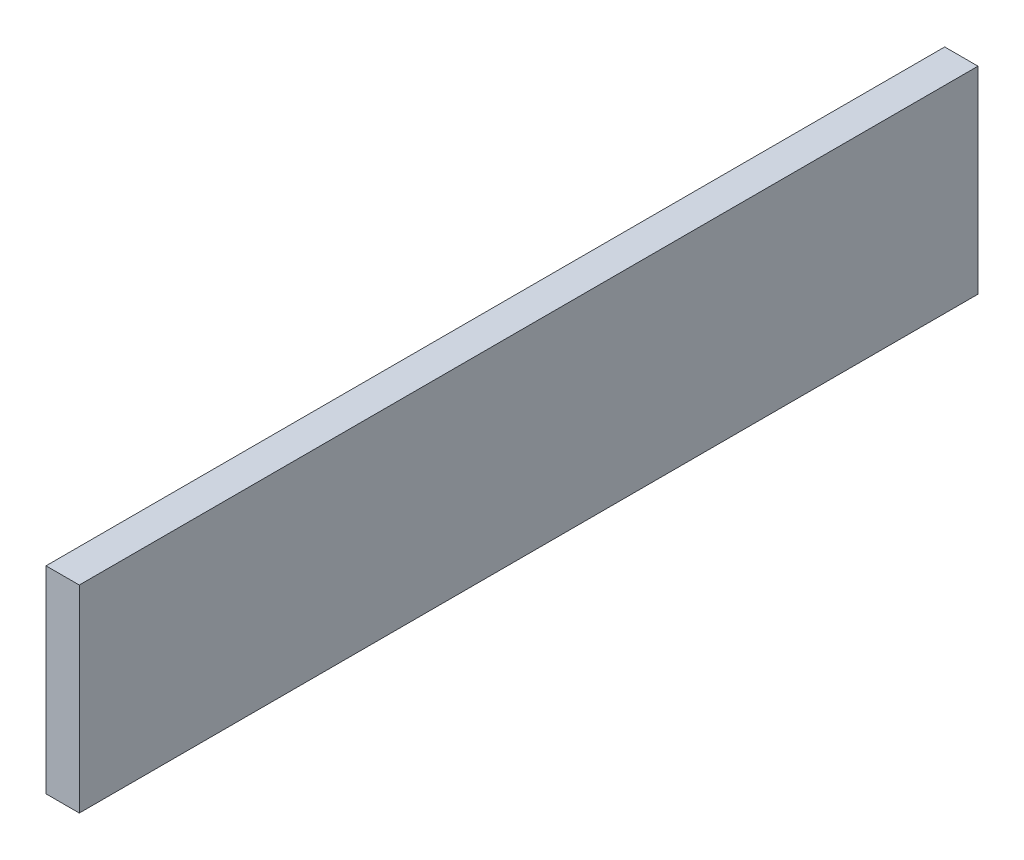
ISO-10303-21;
HEADER;
FILE_DESCRIPTION(('STEP AP214'),'2;1');
FILE_NAME('part.step','',(''),(''),'','','');
FILE_SCHEMA(('AUTOMOTIVE_DESIGN { 1 0 10303 214 1 1 1 1 }'));
ENDSEC;
DATA;
#1=APPLICATION_CONTEXT('core data for automotive mechanical design processes');
#2=APPLICATION_PROTOCOL_DEFINITION('international standard','automotive_design',2000,#1);
#3=PRODUCT_CONTEXT('',#1,'mechanical');
#4=PRODUCT('Part','Part','',(#3));
#5=PRODUCT_RELATED_PRODUCT_CATEGORY('part','',(#4));
#6=PRODUCT_DEFINITION_FORMATION('','',#4);
#7=PRODUCT_DEFINITION_CONTEXT('part definition',#1,'design');
#8=PRODUCT_DEFINITION('design','',#6,#7);
#9=PRODUCT_DEFINITION_SHAPE('','',#8);
#10=(LENGTH_UNIT() NAMED_UNIT(*) SI_UNIT(.MILLI.,.METRE.));
#11=(NAMED_UNIT(*) PLANE_ANGLE_UNIT() SI_UNIT($,.RADIAN.));
#12=(NAMED_UNIT(*) SI_UNIT($,.STERADIAN.) SOLID_ANGLE_UNIT());
#13=UNCERTAINTY_MEASURE_WITH_UNIT(LENGTH_MEASURE(1.E-05),#10,'distance_accuracy_value','');
#14=(GEOMETRIC_REPRESENTATION_CONTEXT(3) GLOBAL_UNCERTAINTY_ASSIGNED_CONTEXT((#13)) GLOBAL_UNIT_ASSIGNED_CONTEXT((#10,
#11,#12)) REPRESENTATION_CONTEXT('',''));
#15=CARTESIAN_POINT('',(0.,0.,0.));
#16=DIRECTION('',(0.,0.,1.));
#17=DIRECTION('',(1.,0.,0.));
#18=AXIS2_PLACEMENT_3D('',#15,#16,#17);
#19=CARTESIAN_POINT('',(15.,0.,0.));
#20=DIRECTION('',(0.,0.,-1.));
#21=DIRECTION('',(-1.,0.,0.));
#22=AXIS2_PLACEMENT_3D('',#19,#20,#21);
#23=PLANE('',#22);
#24=DIRECTION('',(0.,-1.,0.));
#25=VECTOR('',#24,1.);
#26=CARTESIAN_POINT('',(0.,0.,0.));
#27=LINE('',#26,#25);
#28=CARTESIAN_POINT('',(0.,89.,0.));
#29=VERTEX_POINT('',#28);
#30=CARTESIAN_POINT('',(0.,0.,0.));
#31=VERTEX_POINT('',#30);
#32=EDGE_CURVE('E96',#29,#31,#27,.T.);
#33=ORIENTED_EDGE('',*,*,#32,.T.);
#34=DIRECTION('',(-1.,0.,0.));
#35=VECTOR('',#34,1.);
#36=CARTESIAN_POINT('',(15.,0.,0.));
#37=LINE('',#36,#35);
#38=CARTESIAN_POINT('',(15.,0.,0.));
#39=VERTEX_POINT('',#38);
#40=EDGE_CURVE('E11',#39,#31,#37,.T.);
#41=ORIENTED_EDGE('',*,*,#40,.F.);
#42=DIRECTION('',(0.,-1.,0.));
#43=VECTOR('',#42,1.);
#44=CARTESIAN_POINT('',(15.,0.,0.));
#45=LINE('',#44,#43);
#46=CARTESIAN_POINT('',(15.,89.,0.));
#47=VERTEX_POINT('',#46);
#48=EDGE_CURVE('E84',#47,#39,#45,.T.);
#49=ORIENTED_EDGE('',*,*,#48,.F.);
#50=DIRECTION('',(-1.,0.,0.));
#51=VECTOR('',#50,1.);
#52=CARTESIAN_POINT('',(15.,89.,0.));
#53=LINE('',#52,#51);
#54=EDGE_CURVE('E92',#47,#29,#53,.T.);
#55=ORIENTED_EDGE('',*,*,#54,.T.);
#56=EDGE_LOOP('',(#33,#41,#49,#55));
#57=FACE_BOUND('',#56,.T.);
#58=ADVANCED_FACE('F33',(#57),#23,.F.);
#59=CARTESIAN_POINT('',(15.,0.,0.));
#60=DIRECTION('',(0.,1.,0.));
#61=DIRECTION('',(0.,0.,1.));
#62=AXIS2_PLACEMENT_3D('',#59,#60,#61);
#63=PLANE('',#62);
#64=DIRECTION('',(0.,0.,-1.));
#65=VECTOR('',#64,1.);
#66=CARTESIAN_POINT('',(0.,0.,0.));
#67=LINE('',#66,#65);
#68=CARTESIAN_POINT('',(0.,0.,-405.));
#69=VERTEX_POINT('',#68);
#70=EDGE_CURVE('E88',#31,#69,#67,.T.);
#71=ORIENTED_EDGE('',*,*,#70,.T.);
#72=DIRECTION('',(-1.,0.,0.));
#73=VECTOR('',#72,1.);
#74=CARTESIAN_POINT('',(15.,0.,-405.));
#75=LINE('',#74,#73);
#76=CARTESIAN_POINT('',(15.,0.,-405.));
#77=VERTEX_POINT('',#76);
#78=EDGE_CURVE('E41',#77,#69,#75,.T.);
#79=ORIENTED_EDGE('',*,*,#78,.F.);
#80=DIRECTION('',(0.,0.,-1.));
#81=VECTOR('',#80,1.);
#82=CARTESIAN_POINT('',(15.,0.,0.));
#83=LINE('',#82,#81);
#84=EDGE_CURVE('E79',#39,#77,#83,.T.);
#85=ORIENTED_EDGE('',*,*,#84,.F.);
#86=ORIENTED_EDGE('',*,*,#40,.T.);
#87=EDGE_LOOP('',(#71,#79,#85,#86));
#88=FACE_BOUND('',#87,.T.);
#89=ADVANCED_FACE('F87',(#88),#63,.F.);
#90=CARTESIAN_POINT('',(15.,0.,-405.));
#91=DIRECTION('',(0.,0.,1.));
#92=DIRECTION('',(1.,0.,0.));
#93=AXIS2_PLACEMENT_3D('',#90,#91,#92);
#94=PLANE('',#93);
#95=DIRECTION('',(0.,1.,0.));
#96=VECTOR('',#95,1.);
#97=CARTESIAN_POINT('',(0.,0.,-405.));
#98=LINE('',#97,#96);
#99=CARTESIAN_POINT('',(0.,89.,-405.));
#100=VERTEX_POINT('',#99);
#101=EDGE_CURVE('E66',#69,#100,#98,.T.);
#102=ORIENTED_EDGE('',*,*,#101,.T.);
#103=DIRECTION('',(-1.,0.,0.));
#104=VECTOR('',#103,1.);
#105=CARTESIAN_POINT('',(15.,89.,-405.));
#106=LINE('',#105,#104);
#107=CARTESIAN_POINT('',(15.,89.,-405.));
#108=VERTEX_POINT('',#107);
#109=EDGE_CURVE('E89',#108,#100,#106,.T.);
#110=ORIENTED_EDGE('',*,*,#109,.F.);
#111=DIRECTION('',(0.,1.,0.));
#112=VECTOR('',#111,1.);
#113=CARTESIAN_POINT('',(15.,0.,-405.));
#114=LINE('',#113,#112);
#115=EDGE_CURVE('E82',#77,#108,#114,.T.);
#116=ORIENTED_EDGE('',*,*,#115,.F.);
#117=ORIENTED_EDGE('',*,*,#78,.T.);
#118=EDGE_LOOP('',(#102,#110,#116,#117));
#119=FACE_BOUND('',#118,.T.);
#120=ADVANCED_FACE('F90',(#119),#94,.F.);
#121=CARTESIAN_POINT('',(15.,89.,0.));
#122=DIRECTION('',(0.,-1.,0.));
#123=DIRECTION('',(0.,0.,-1.));
#124=AXIS2_PLACEMENT_3D('',#121,#122,#123);
#125=PLANE('',#124);
#126=DIRECTION('',(0.,0.,1.));
#127=VECTOR('',#126,1.);
#128=CARTESIAN_POINT('',(0.,89.,0.));
#129=LINE('',#128,#127);
#130=EDGE_CURVE('E72',#100,#29,#129,.T.);
#131=ORIENTED_EDGE('',*,*,#130,.T.);
#132=ORIENTED_EDGE('',*,*,#54,.F.);
#133=DIRECTION('',(0.,0.,1.));
#134=VECTOR('',#133,1.);
#135=CARTESIAN_POINT('',(15.,89.,0.));
#136=LINE('',#135,#134);
#137=EDGE_CURVE('E49',#108,#47,#136,.T.);
#138=ORIENTED_EDGE('',*,*,#137,.F.);
#139=ORIENTED_EDGE('',*,*,#109,.T.);
#140=EDGE_LOOP('',(#131,#132,#138,#139));
#141=FACE_BOUND('',#140,.T.);
#142=ADVANCED_FACE('F103',(#141),#125,.F.);
#143=CARTESIAN_POINT('',(15.,0.,0.));
#144=DIRECTION('',(-1.,0.,0.));
#145=DIRECTION('',(0.,0.,1.));
#146=AXIS2_PLACEMENT_3D('',#143,#144,#145);
#147=PLANE('',#146);
#148=ORIENTED_EDGE('',*,*,#48,.T.);
#149=ORIENTED_EDGE('',*,*,#84,.T.);
#150=ORIENTED_EDGE('',*,*,#115,.T.);
#151=ORIENTED_EDGE('',*,*,#137,.T.);
#152=EDGE_LOOP('',(#148,#149,#150,#151));
#153=FACE_BOUND('',#152,.T.);
#154=ADVANCED_FACE('F80',(#153),#147,.F.);
#155=CARTESIAN_POINT('',(0.,0.,0.));
#156=DIRECTION('',(-1.,0.,0.));
#157=DIRECTION('',(0.,0.,1.));
#158=AXIS2_PLACEMENT_3D('',#155,#156,#157);
#159=PLANE('',#158);
#160=ORIENTED_EDGE('',*,*,#32,.F.);
#161=ORIENTED_EDGE('',*,*,#130,.F.);
#162=ORIENTED_EDGE('',*,*,#101,.F.);
#163=ORIENTED_EDGE('',*,*,#70,.F.);
#164=EDGE_LOOP('',(#160,#161,#162,#163));
#165=FACE_BOUND('',#164,.T.);
#166=ADVANCED_FACE('F106',(#165),#159,.T.);
#167=CLOSED_SHELL('',(#58,#89,#120,#142,#154,#166));
#168=MANIFOLD_SOLID_BREP('B2',#167);
#169=ADVANCED_BREP_SHAPE_REPRESENTATION('',(#18,#168),#14);
#170=SHAPE_DEFINITION_REPRESENTATION(#9,#169);
ENDSEC;
END-ISO-10303-21;
